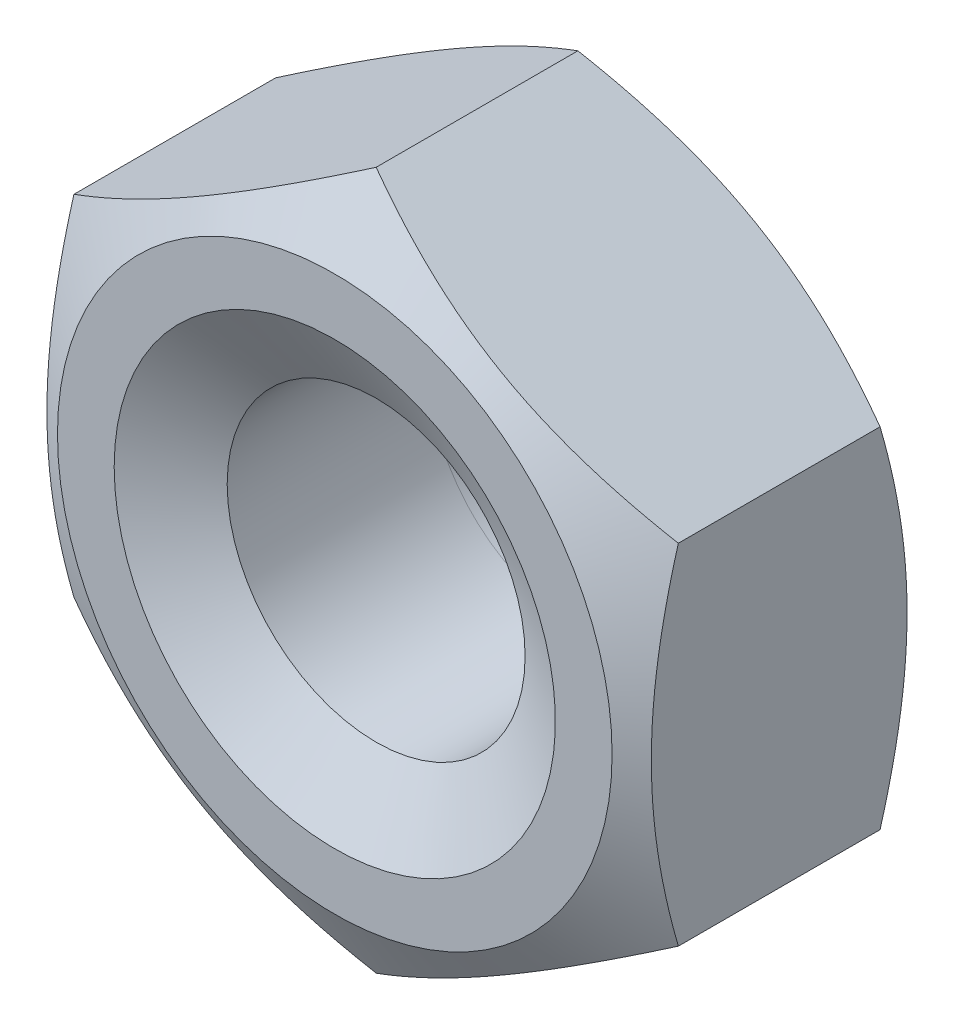
ISO-10303-21;
HEADER;
FILE_DESCRIPTION(('STEP AP214'),'2;1');
FILE_NAME('part.step','',(''),(''),'','','');
FILE_SCHEMA(('AUTOMOTIVE_DESIGN { 1 0 10303 214 1 1 1 1 }'));
ENDSEC;
DATA;
#1=APPLICATION_CONTEXT('core data for automotive mechanical design processes');
#2=APPLICATION_PROTOCOL_DEFINITION('international standard','automotive_design',2000,#1);
#3=PRODUCT_CONTEXT('',#1,'mechanical');
#4=PRODUCT('Part','Part','',(#3));
#5=PRODUCT_RELATED_PRODUCT_CATEGORY('part','',(#4));
#6=PRODUCT_DEFINITION_FORMATION('','',#4);
#7=PRODUCT_DEFINITION_CONTEXT('part definition',#1,'design');
#8=PRODUCT_DEFINITION('design','',#6,#7);
#9=PRODUCT_DEFINITION_SHAPE('','',#8);
#10=(LENGTH_UNIT() NAMED_UNIT(*) SI_UNIT(.MILLI.,.METRE.));
#11=(NAMED_UNIT(*) PLANE_ANGLE_UNIT() SI_UNIT($,.RADIAN.));
#12=(NAMED_UNIT(*) SI_UNIT($,.STERADIAN.) SOLID_ANGLE_UNIT());
#13=UNCERTAINTY_MEASURE_WITH_UNIT(LENGTH_MEASURE(1.E-05),#10,'distance_accuracy_value','');
#14=(GEOMETRIC_REPRESENTATION_CONTEXT(3) GLOBAL_UNCERTAINTY_ASSIGNED_CONTEXT((#13)) GLOBAL_UNIT_ASSIGNED_CONTEXT((#10,
#11,#12)) REPRESENTATION_CONTEXT('',''));
#15=CARTESIAN_POINT('',(0.,0.,0.));
#16=DIRECTION('',(0.,0.,1.));
#17=DIRECTION('',(1.,0.,0.));
#18=AXIS2_PLACEMENT_3D('',#15,#16,#17);
#19=CARTESIAN_POINT('',(0.,0.,0.));
#20=DIRECTION('',(0.,0.,-1.));
#21=DIRECTION('',(-1.,0.,0.));
#22=AXIS2_PLACEMENT_3D('',#19,#20,#21);
#23=CONICAL_SURFACE('',#22,6.20495457622364,1.0471975511966);
#24=CARTESIAN_POINT('',(0.,0.,1.16333456698759));
#25=DIRECTION('',(0.,0.,-1.));
#26=DIRECTION('',(-1.,0.,0.));
#27=AXIS2_PLACEMENT_3D('',#24,#25,#26);
#28=CIRCLE('',#27,4.19);
#29=CARTESIAN_POINT('',(-4.19,0.,1.16333456698759));
#30=VERTEX_POINT('',#29);
#31=EDGE_CURVE('E11',#30,#30,#28,.T.);
#32=ORIENTED_EDGE('',*,*,#31,.T.);
#33=EDGE_LOOP('',(#32));
#34=FACE_BOUND('',#33,.T.);
#35=CARTESIAN_POINT('',(0.,0.,0.));
#36=DIRECTION('',(0.,0.,-1.));
#37=DIRECTION('',(-1.,0.,0.));
#38=AXIS2_PLACEMENT_3D('',#35,#36,#37);
#39=CIRCLE('',#38,6.20495457622364);
#40=CARTESIAN_POINT('',(-6.20495457622364,0.,0.));
#41=VERTEX_POINT('',#40);
#42=EDGE_CURVE('E69',#41,#41,#39,.T.);
#43=ORIENTED_EDGE('',*,*,#42,.F.);
#44=EDGE_LOOP('',(#43));
#45=FACE_BOUND('',#44,.T.);
#46=ADVANCED_FACE('F56',(#34,#45),#23,.T.);
#47=CARTESIAN_POINT('',(0.,0.,0.));
#48=DIRECTION('',(0.,0.,-1.));
#49=DIRECTION('',(-1.,0.,0.));
#50=AXIS2_PLACEMENT_3D('',#47,#48,#49);
#51=CYLINDRICAL_SURFACE('',#50,4.19);
#52=CARTESIAN_POINT('',(0.,0.,0.));
#53=DIRECTION('',(0.,0.,-1.));
#54=DIRECTION('',(-1.,0.,0.));
#55=AXIS2_PLACEMENT_3D('',#52,#53,#54);
#56=CIRCLE('',#55,4.19);
#57=CARTESIAN_POINT('',(-4.19,0.,0.));
#58=VERTEX_POINT('',#57);
#59=EDGE_CURVE('E63',#58,#58,#56,.T.);
#60=ORIENTED_EDGE('',*,*,#59,.T.);
#61=EDGE_LOOP('',(#60));
#62=FACE_BOUND('',#61,.T.);
#63=ORIENTED_EDGE('',*,*,#31,.F.);
#64=EDGE_LOOP('',(#63));
#65=FACE_BOUND('',#64,.T.);
#66=ADVANCED_FACE('F83',(#62,#65),#51,.F.);
#67=CARTESIAN_POINT('',(0.,0.,0.));
#68=DIRECTION('',(0.,0.,1.));
#69=DIRECTION('',(1.,0.,0.));
#70=AXIS2_PLACEMENT_3D('',#67,#68,#69);
#71=PLANE('',#70);
#72=ORIENTED_EDGE('',*,*,#59,.F.);
#73=EDGE_LOOP('',(#72));
#74=FACE_BOUND('',#73,.T.);
#75=ORIENTED_EDGE('',*,*,#42,.T.);
#76=EDGE_LOOP('',(#75));
#77=FACE_BOUND('',#76,.T.);
#78=ADVANCED_FACE('F80',(#74,#77),#71,.F.);
#79=CLOSED_SHELL('',(#46,#66,#78));
#80=MANIFOLD_SOLID_BREP('B2_NOT_SHOWN',#79);
#81=CARTESIAN_POINT('',(-8.5,14.7224318643355,8.));
#82=DIRECTION('',(0.,0.,1.));
#83=DIRECTION('',(1.,0.,0.));
#84=AXIS2_PLACEMENT_3D('',#81,#82,#83);
#85=PLANE('',#84);
#86=CARTESIAN_POINT('',(0.,0.,8.));
#87=DIRECTION('',(0.,0.,-1.));
#88=DIRECTION('',(-1.,0.,0.));
#89=AXIS2_PLACEMENT_3D('',#86,#87,#88);
#90=CIRCLE('',#89,6.20495457622364);
#91=CARTESIAN_POINT('',(-6.20495457622364,0.,8.));
#92=VERTEX_POINT('',#91);
#93=EDGE_CURVE('E377',#92,#92,#90,.T.);
#94=ORIENTED_EDGE('',*,*,#93,.T.);
#95=EDGE_LOOP('',(#94));
#96=FACE_BOUND('',#95,.T.);
#97=CARTESIAN_POINT('',(0.,0.,8.));
#98=DIRECTION('',(0.,0.,-1.));
#99=DIRECTION('',(-1.,0.,0.));
#100=AXIS2_PLACEMENT_3D('',#97,#98,#99);
#101=CIRCLE('',#100,7.8);
#102=CARTESIAN_POINT('',(-7.8,0.,8.));
#103=VERTEX_POINT('',#102);
#104=EDGE_CURVE('E397',#103,#103,#101,.T.);
#105=ORIENTED_EDGE('',*,*,#104,.F.);
#106=EDGE_LOOP('',(#105));
#107=FACE_BOUND('',#106,.T.);
#108=ADVANCED_FACE('F135',(#96,#107),#85,.T.);
#109=CARTESIAN_POINT('',(8.5,4.90747728811182,8.));
#110=DIRECTION('',(-0.5,-0.866025403784439,0.));
#111=DIRECTION('',(0.866025403784439,-0.5,0.));
#112=AXIS2_PLACEMENT_3D('',#109,#110,#111);
#113=PLANE('',#112);
#114=DIRECTION('',(0.,0.,-1.));
#115=VECTOR('',#114,1.);
#116=CARTESIAN_POINT('',(8.5,4.90747728811182,8.));
#117=LINE('',#116,#115);
#118=CARTESIAN_POINT('',(8.5,4.90747728811182,6.83666543301241));
#119=VERTEX_POINT('',#118);
#120=CARTESIAN_POINT('',(8.5,4.90747728811182,1.16333456698759));
#121=VERTEX_POINT('',#120);
#122=EDGE_CURVE('E328',#119,#121,#117,.T.);
#123=ORIENTED_EDGE('',*,*,#122,.T.);
#124=CARTESIAN_POINT('',(8.5002,4.90736181805798,1.16340123483071));
#125=CARTESIAN_POINT('',(8.31336077237731,5.01523349642113,1.10113132768166));
#126=CARTESIAN_POINT('',(8.1258249420654,5.1235073585344,1.04168748418008));
#127=CARTESIAN_POINT('',(7.74923024542823,5.34093440801326,0.929230299192993));
#128=CARTESIAN_POINT('',(7.56017075895663,5.45008795342049,0.876219733415823));
#129=CARTESIAN_POINT('',(6.9899652414386,5.77929626245294,0.727878578163194));
#130=CARTESIAN_POINT('',(6.60656835850853,6.00065055601907,0.643504116370523));
#131=CARTESIAN_POINT('',(6.03282233512584,6.33190297706555,0.544565204127492));
#132=CARTESIAN_POINT('',(5.84418723571481,6.44081150248912,0.516380387880935));
#133=CARTESIAN_POINT('',(5.46606397867089,6.65912106673029,0.469119273198939));
#134=CARTESIAN_POINT('',(5.27657589790345,6.76852206116959,0.450042169985699));
#135=CARTESIAN_POINT('',(4.89727347240179,6.98751241863725,0.421479961098541));
#136=CARTESIAN_POINT('',(4.7074597439177,7.09710142587343,0.41198396990407));
#137=CARTESIAN_POINT('',(4.32765694543931,7.3163806738139,0.402787568071793));
#138=CARTESIAN_POINT('',(4.13766788104353,7.42607091128589,0.403086854800002));
#139=CARTESIAN_POINT('',(3.78247698881905,7.6311404685254,0.412799664006246));
#140=CARTESIAN_POINT('',(3.6172500947862,7.72653426027263,0.421028357030297));
#141=CARTESIAN_POINT('',(3.28718328645605,7.9170984209126,0.444734429489645));
#142=CARTESIAN_POINT('',(3.12234339899756,8.01226877430995,0.460212297551543));
#143=CARTESIAN_POINT('',(2.62846189929869,8.29741139110887,0.517153809291383));
#144=CARTESIAN_POINT('',(2.30029449767179,8.48687892877742,0.56911824971035));
#145=CARTESIAN_POINT('',(1.64047857245564,8.86782383081656,0.699030128955685));
#146=CARTESIAN_POINT('',(1.30891425770532,9.05925257719133,0.777528258304779));
#147=CARTESIAN_POINT('',(0.650730106539539,9.43925537404324,0.955686528405369));
#148=CARTESIAN_POINT('',(0.324101841568922,9.62783429074897,1.05530482456272));
#149=CARTESIAN_POINT('',(-0.000199999999997153,9.81507004627748,1.16340123483071));
#150=B_SPLINE_CURVE_WITH_KNOTS('',3,(#124,#125,#126,#127,#128,#129,#130,#131,#132,#133,#134,
#135,#136,#137,#138,#139,#140,#141,#142,#143,#144,#145,#146,#147,#148,#149),.UNSPECIFIED.,.F.,
.F.,(4,2,2,2,2,2,2,2,2,2,2,2,4),(0.,0.673596396411509,1.34748239783842,2.69805431639326,
3.356799954547,4.01548737369114,4.67342558367776,5.33134346608656,5.9040955679884,
6.47688628148364,7.62328361419565,8.79510569878586,9.9646274374873),.UNSPECIFIED.);
#151=CARTESIAN_POINT('',(0.,9.81495457622364,1.16333456698759));
#152=VERTEX_POINT('',#151);
#153=EDGE_CURVE('E158',#121,#152,#150,.T.);
#154=ORIENTED_EDGE('',*,*,#153,.T.);
#155=DIRECTION('',(0.,0.,-1.));
#156=VECTOR('',#155,1.);
#157=CARTESIAN_POINT('',(0.,9.81495457622364,8.));
#158=LINE('',#157,#156);
#159=CARTESIAN_POINT('',(0.,9.81495457622364,6.83666543301241));
#160=VERTEX_POINT('',#159);
#161=EDGE_CURVE('E212',#160,#152,#158,.T.);
#162=ORIENTED_EDGE('',*,*,#161,.F.);
#163=CARTESIAN_POINT('',(-0.000199999999998283,9.81507004627748,6.83659876516929));
#164=CARTESIAN_POINT('',(0.186639227622692,9.70719836791434,6.89886867231834));
#165=CARTESIAN_POINT('',(0.374175057934598,9.59892450580106,6.95831251581992));
#166=CARTESIAN_POINT('',(0.750769754571765,9.3814974563222,7.07076970080701));
#167=CARTESIAN_POINT('',(0.93982924104337,9.27234391091497,7.12378026658418));
#168=CARTESIAN_POINT('',(1.5100347585614,8.94313560188252,7.2721214218368));
#169=CARTESIAN_POINT('',(1.89343164149147,8.72178130831638,7.35649588362948));
#170=CARTESIAN_POINT('',(2.46717766487416,8.39052888726991,7.45543479587251));
#171=CARTESIAN_POINT('',(2.65581276428519,8.28162036184634,7.48361961211907));
#172=CARTESIAN_POINT('',(3.03393602132911,8.06331079760518,7.53088072680106));
#173=CARTESIAN_POINT('',(3.22342410209655,7.95390980316587,7.5499578300143));
#174=CARTESIAN_POINT('',(3.60272652759821,7.73491944569821,7.57852003890146));
#175=CARTESIAN_POINT('',(3.7925402560823,7.62533043846203,7.58801603009593));
#176=CARTESIAN_POINT('',(4.17234305456069,7.40605119052156,7.59721243192821));
#177=CARTESIAN_POINT('',(4.36233211895647,7.29636095304957,7.5969131452));
#178=CARTESIAN_POINT('',(4.71752301118095,7.09129139581006,7.58720033599375));
#179=CARTESIAN_POINT('',(4.8827499052138,6.99589760406283,7.5789716429697));
#180=CARTESIAN_POINT('',(5.21281671354395,6.80533344342286,7.55526557051035));
#181=CARTESIAN_POINT('',(5.37765660100244,6.71016309002551,7.53978770244846));
#182=CARTESIAN_POINT('',(5.87153810070131,6.42502047322659,7.48284619070862));
#183=CARTESIAN_POINT('',(6.19970550232821,6.23555293555804,7.43088175028965));
#184=CARTESIAN_POINT('',(6.85952142754436,5.8546080335189,7.30096987104432));
#185=CARTESIAN_POINT('',(7.19108574229468,5.66317928714413,7.22247174169522));
#186=CARTESIAN_POINT('',(7.84926989346046,5.28317649029222,7.04431347159463));
#187=CARTESIAN_POINT('',(8.17589815843108,5.09459757358649,6.94469517543729));
#188=CARTESIAN_POINT('',(8.5002,4.90736181805798,6.83659876516929));
#189=B_SPLINE_CURVE_WITH_KNOTS('',3,(#163,#164,#165,#166,#167,#168,#169,#170,#171,#172,#173,
#174,#175,#176,#177,#178,#179,#180,#181,#182,#183,#184,#185,#186,#187,#188),.UNSPECIFIED.,.F.,
.F.,(4,2,2,2,2,2,2,2,2,2,2,2,4),(0.,0.673596396411509,1.34748239783842,2.69805431639326,
3.356799954547,4.01548737369114,4.67342558367776,5.33134346608656,5.9040955679884,
6.47688628148364,7.62328361419565,8.79510569878586,9.9646274374873),.UNSPECIFIED.);
#190=EDGE_CURVE('E316',#160,#119,#189,.T.);
#191=ORIENTED_EDGE('',*,*,#190,.T.);
#192=EDGE_LOOP('',(#123,#154,#162,#191));
#193=FACE_BOUND('',#192,.T.);
#194=ADVANCED_FACE('F137',(#193),#113,.F.);
#195=CARTESIAN_POINT('',(0.,9.81495457622364,8.));
#196=DIRECTION('',(0.5,-0.866025403784439,0.));
#197=DIRECTION('',(0.866025403784439,0.5,0.));
#198=AXIS2_PLACEMENT_3D('',#195,#196,#197);
#199=PLANE('',#198);
#200=ORIENTED_EDGE('',*,*,#161,.T.);
#201=CARTESIAN_POINT('',(0.000200000000001764,9.81507004627748,1.16340123483071));
#202=CARTESIAN_POINT('',(-0.18663922762269,9.70719836791434,1.10113132768166));
#203=CARTESIAN_POINT('',(-0.374175057934596,9.59892450580106,1.04168748418008));
#204=CARTESIAN_POINT('',(-0.750769754571762,9.3814974563222,0.929230299192994));
#205=CARTESIAN_POINT('',(-0.939829241043366,9.27234391091497,0.876219733415823));
#206=CARTESIAN_POINT('',(-1.5100347585614,8.94313560188252,0.727878578163194));
#207=CARTESIAN_POINT('',(-1.89343164149147,8.72178130831639,0.643504116370523));
#208=CARTESIAN_POINT('',(-2.46717766487416,8.39052888726991,0.544565204127491));
#209=CARTESIAN_POINT('',(-2.65581276428518,8.28162036184634,0.516380387880934));
#210=CARTESIAN_POINT('',(-3.03393602132911,8.06331079760518,0.469119273198939));
#211=CARTESIAN_POINT('',(-3.22342410209654,7.95390980316587,0.450042169985699));
#212=CARTESIAN_POINT('',(-3.6027265275982,7.73491944569821,0.421479961098542));
#213=CARTESIAN_POINT('',(-3.79254025608229,7.62533043846204,0.41198396990407));
#214=CARTESIAN_POINT('',(-4.17234305456069,7.40605119052156,0.402787568071792));
#215=CARTESIAN_POINT('',(-4.36233211895647,7.29636095304957,0.403086854800002));
#216=CARTESIAN_POINT('',(-4.71752301118095,7.09129139581007,0.412799664006246));
#217=CARTESIAN_POINT('',(-4.8827499052138,6.99589760406283,0.421028357030298));
#218=CARTESIAN_POINT('',(-5.21281671354395,6.80533344342286,0.444734429489645));
#219=CARTESIAN_POINT('',(-5.37765660100244,6.71016309002551,0.460212297551543));
#220=CARTESIAN_POINT('',(-5.87153810070131,6.42502047322659,0.517153809291382));
#221=CARTESIAN_POINT('',(-6.19970550232821,6.23555293555804,0.56911824971035));
#222=CARTESIAN_POINT('',(-6.85952142754436,5.8546080335189,0.699030128955685));
#223=CARTESIAN_POINT('',(-7.19108574229468,5.66317928714413,0.777528258304779));
#224=CARTESIAN_POINT('',(-7.84926989346046,5.28317649029222,0.95568652840537));
#225=CARTESIAN_POINT('',(-8.17589815843108,5.09459757358649,1.05530482456272));
#226=CARTESIAN_POINT('',(-8.5002,4.90736181805798,1.16340123483071));
#227=B_SPLINE_CURVE_WITH_KNOTS('',3,(#201,#202,#203,#204,#205,#206,#207,#208,#209,#210,#211,
#212,#213,#214,#215,#216,#217,#218,#219,#220,#221,#222,#223,#224,#225,#226),.UNSPECIFIED.,.F.,
.F.,(4,2,2,2,2,2,2,2,2,2,2,2,4),(0.,0.673596396411509,1.34748239783842,2.69805431639326,
3.356799954547,4.01548737369113,4.67342558367776,5.33134346608656,5.9040955679884,
6.47688628148364,7.62328361419565,8.79510569878586,9.9646274374873),.UNSPECIFIED.);
#228=CARTESIAN_POINT('',(-8.5,4.90747728811182,1.16333456698759));
#229=VERTEX_POINT('',#228);
#230=EDGE_CURVE('E196',#152,#229,#227,.T.);
#231=ORIENTED_EDGE('',*,*,#230,.T.);
#232=DIRECTION('',(0.,0.,-1.));
#233=VECTOR('',#232,1.);
#234=CARTESIAN_POINT('',(-8.5,4.90747728811182,8.));
#235=LINE('',#234,#233);
#236=CARTESIAN_POINT('',(-8.5,4.90747728811182,6.83666543301241));
#237=VERTEX_POINT('',#236);
#238=EDGE_CURVE('E210',#237,#229,#235,.T.);
#239=ORIENTED_EDGE('',*,*,#238,.F.);
#240=CARTESIAN_POINT('',(-8.5002,4.90736181805798,6.83659876516929));
#241=CARTESIAN_POINT('',(-8.31336077237731,5.01523349642113,6.89886867231834));
#242=CARTESIAN_POINT('',(-8.1258249420654,5.1235073585344,6.95831251581992));
#243=CARTESIAN_POINT('',(-7.74923024542824,5.34093440801326,7.07076970080701));
#244=CARTESIAN_POINT('',(-7.56017075895663,5.45008795342049,7.12378026658418));
#245=CARTESIAN_POINT('',(-6.9899652414386,5.77929626245294,7.2721214218368));
#246=CARTESIAN_POINT('',(-6.60656835850853,6.00065055601907,7.35649588362948));
#247=CARTESIAN_POINT('',(-6.03282233512584,6.33190297706555,7.45543479587251));
#248=CARTESIAN_POINT('',(-5.84418723571482,6.44081150248912,7.48361961211906));
#249=CARTESIAN_POINT('',(-5.46606397867089,6.65912106673029,7.53088072680106));
#250=CARTESIAN_POINT('',(-5.27657589790346,6.76852206116959,7.5499578300143));
#251=CARTESIAN_POINT('',(-4.8972734724018,6.98751241863725,7.57852003890146));
#252=CARTESIAN_POINT('',(-4.70745974391771,7.09710142587342,7.58801603009593));
#253=CARTESIAN_POINT('',(-4.32765694543931,7.3163806738139,7.59721243192821));
#254=CARTESIAN_POINT('',(-4.13766788104353,7.42607091128589,7.5969131452));
#255=CARTESIAN_POINT('',(-3.78247698881905,7.63114046852539,7.58720033599375));
#256=CARTESIAN_POINT('',(-3.6172500947862,7.72653426027263,7.5789716429697));
#257=CARTESIAN_POINT('',(-3.28718328645605,7.9170984209126,7.55526557051036));
#258=CARTESIAN_POINT('',(-3.12234339899756,8.01226877430995,7.53978770244846));
#259=CARTESIAN_POINT('',(-2.62846189929869,8.29741139110887,7.48284619070862));
#260=CARTESIAN_POINT('',(-2.30029449767179,8.48687892877742,7.43088175028965));
#261=CARTESIAN_POINT('',(-1.64047857245564,8.86782383081656,7.30096987104432));
#262=CARTESIAN_POINT('',(-1.30891425770532,9.05925257719133,7.22247174169522));
#263=CARTESIAN_POINT('',(-0.650730106539535,9.43925537404324,7.04431347159463));
#264=CARTESIAN_POINT('',(-0.324101841568919,9.62783429074897,6.94469517543728));
#265=CARTESIAN_POINT('',(0.000200000000002754,9.81507004627748,6.83659876516929));
#266=B_SPLINE_CURVE_WITH_KNOTS('',3,(#240,#241,#242,#243,#244,#245,#246,#247,#248,#249,#250,
#251,#252,#253,#254,#255,#256,#257,#258,#259,#260,#261,#262,#263,#264,#265),.UNSPECIFIED.,.F.,
.F.,(4,2,2,2,2,2,2,2,2,2,2,2,4),(0.,0.673596396411509,1.34748239783842,2.69805431639326,
3.356799954547,4.01548737369113,4.67342558367776,5.33134346608656,5.9040955679884,
6.47688628148364,7.62328361419565,8.79510569878586,9.9646274374873),.UNSPECIFIED.);
#267=EDGE_CURVE('E308',#237,#160,#266,.T.);
#268=ORIENTED_EDGE('',*,*,#267,.T.);
#269=EDGE_LOOP('',(#200,#231,#239,#268));
#270=FACE_BOUND('',#269,.T.);
#271=ADVANCED_FACE('F208',(#270),#199,.F.);
#272=CARTESIAN_POINT('',(-8.5,4.90747728811182,8.));
#273=DIRECTION('',(1.,0.,0.));
#274=DIRECTION('',(0.,0.,-1.));
#275=AXIS2_PLACEMENT_3D('',#272,#273,#274);
#276=PLANE('',#275);
#277=ORIENTED_EDGE('',*,*,#238,.T.);
#278=CARTESIAN_POINT('',(-8.5,-12.9593811954136,4.4445831317783));
#279=CARTESIAN_POINT('',(-8.5,-12.7730052801023,4.35460816068386));
#280=CARTESIAN_POINT('',(-8.5,-12.5864024892101,4.26510337156205));
#281=CARTESIAN_POINT('',(-8.5,-12.2126952107654,4.08714221370697));
#282=CARTESIAN_POINT('',(-8.5,-12.025590717641,3.99868585667748));
#283=CARTESIAN_POINT('',(-8.5,-11.4633970632728,3.73502546749699));
#284=CARTESIAN_POINT('',(-8.5,-11.0874893107814,3.56155993429166));
#285=CARTESIAN_POINT('',(-8.5,-10.3308772057093,3.21939149987906));
#286=CARTESIAN_POINT('',(-8.5,-9.9501576776206,3.05072206921138));
#287=CARTESIAN_POINT('',(-8.5,-9.1855693370199,2.72070617005383));
#288=CARTESIAN_POINT('',(-8.5,-8.80170069187936,2.55935931531802));
#289=CARTESIAN_POINT('',(-8.5,-8.02569881715881,2.24413413817331));
#290=CARTESIAN_POINT('',(-8.5,-7.63352136661533,2.0903640711098));
#291=CARTESIAN_POINT('',(-8.5,-6.84452195864929,1.79500723622546));
#292=CARTESIAN_POINT('',(-8.5,-6.44769948801445,1.65342182935858));
#293=CARTESIAN_POINT('',(-8.5,-5.64960766642233,1.3862805018689));
#294=CARTESIAN_POINT('',(-8.5,-5.24835001704123,1.2606900070764));
#295=CARTESIAN_POINT('',(-8.5,-4.44014768400429,1.02965111465765));
#296=CARTESIAN_POINT('',(-8.5,-4.03320485775414,0.924196296349474));
#297=CARTESIAN_POINT('',(-8.5,-3.21326379597258,0.738586665979706));
#298=CARTESIAN_POINT('',(-8.5,-2.80026330009668,0.658441562898872));
#299=CARTESIAN_POINT('',(-8.5,-2.17717665803347,0.561251071232788));
#300=CARTESIAN_POINT('',(-8.5,-1.9688578368949,0.53269002284868));
#301=CARTESIAN_POINT('',(-8.5,-1.55126238584582,0.483806396667087));
#302=CARTESIAN_POINT('',(-8.5,-1.34198584829874,0.463483040670459));
#303=CARTESIAN_POINT('',(-8.5,-0.924053900024569,0.431619177068178));
#304=CARTESIAN_POINT('',(-8.5,-0.715402554872798,0.420025554292556));
#305=CARTESIAN_POINT('',(-8.5,-0.297796839610751,0.405681493287387));
#306=CARTESIAN_POINT('',(-8.5,-0.0888424740630232,0.402930923263948));
#307=CARTESIAN_POINT('',(-8.5,0.328936821405097,0.406338273136352));
#308=CARTESIAN_POINT('',(-8.5,0.537761771119559,0.412493742516634));
#309=CARTESIAN_POINT('',(-8.5,0.954972412879199,0.433561739196107));
#310=CARTESIAN_POINT('',(-8.5,1.16335808042936,0.448474742508637));
#311=CARTESIAN_POINT('',(-8.5,1.67007705909359,0.49507694159087));
#312=CARTESIAN_POINT('',(-8.5,1.96800623316433,0.53124598480231));
#313=CARTESIAN_POINT('',(-8.5,2.56149280023897,0.619457609123701));
#314=CARTESIAN_POINT('',(-8.5,2.85704982708992,0.671502594179794));
#315=CARTESIAN_POINT('',(-8.5,3.74069699438318,0.84883680724302));
#316=CARTESIAN_POINT('',(-8.5,4.32460385613245,0.995205199839942));
#317=CARTESIAN_POINT('',(-8.5,5.1979207194104,1.24711186403324));
#318=CARTESIAN_POINT('',(-8.5,5.49190536098573,1.33768665934155));
#319=CARTESIAN_POINT('',(-8.5,6.0770346057582,1.52775049917863));
#320=CARTESIAN_POINT('',(-8.5,6.36817895260368,1.62724034023299));
#321=CARTESIAN_POINT('',(-8.5,6.94617309568548,1.83301127839105));
#322=CARTESIAN_POINT('',(-8.5,7.23303787739934,1.93925070764852));
#323=CARTESIAN_POINT('',(-8.5,7.80433444975845,2.15780678037037));
#324=CARTESIAN_POINT('',(-8.5,8.08876704344191,2.2701213206029));
#325=CARTESIAN_POINT('',(-8.5,8.37217691898802,2.38490295154742));
#326=B_SPLINE_CURVE_WITH_KNOTS('',3,(#278,#279,#280,#281,#282,#283,#284,#285,#286,#287,#288,
#289,#290,#291,#292,#293,#294,#295,#296,#297,#298,#299,#300,#301,#302,#303,#304,#305,#306,#307,
#308,#309,#310,#311,#312,#313,#314,#315,#316,#317,#318,#319,#320,#321,#322,#323,#324,#325),
.UNSPECIFIED.,.F.,.F.,(4,2,2,2,2,2,2,2,2,2,2,2,2,2,2,2,2,2,2,2,2,2,2,4),(0.,0.620871786792665,
1.2417504979445,2.48371317454651,3.73288141488302,4.98198368823383,6.24556546838779,
7.50928820041589,8.77023118755629,10.0307714226948,11.2917946239997,11.9224600677605,
12.5530659198622,13.1798032023583,13.8065311441288,14.4330866731729,15.0596762616224,
15.959513715216,16.8594874905142,18.6629162365996,19.5857095322113,20.5085853582746,
21.4262327978788,22.3435645521087),.UNSPECIFIED.);
#327=CARTESIAN_POINT('',(-8.5,-4.90747728811182,1.16333456698759));
#328=VERTEX_POINT('',#327);
#329=EDGE_CURVE('E193',#229,#328,#326,.F.);
#330=ORIENTED_EDGE('',*,*,#329,.T.);
#331=DIRECTION('',(0.,0.,-1.));
#332=VECTOR('',#331,1.);
#333=CARTESIAN_POINT('',(-8.5,-4.90747728811182,8.));
#334=LINE('',#333,#332);
#335=CARTESIAN_POINT('',(-8.5,-4.90747728811183,6.83666543301241));
#336=VERTEX_POINT('',#335);
#337=EDGE_CURVE('E219',#336,#328,#334,.T.);
#338=ORIENTED_EDGE('',*,*,#337,.F.);
#339=CARTESIAN_POINT('',(-8.5,-12.9593811954136,3.5554168682217));
#340=CARTESIAN_POINT('',(-8.5,-12.7730052801023,3.64539183931614));
#341=CARTESIAN_POINT('',(-8.5,-12.5864024892101,3.73489662843795));
#342=CARTESIAN_POINT('',(-8.5,-12.2126952107654,3.91285778629303));
#343=CARTESIAN_POINT('',(-8.5,-12.025590717641,4.00131414332252));
#344=CARTESIAN_POINT('',(-8.5,-11.4633970632729,4.26497453250301));
#345=CARTESIAN_POINT('',(-8.5,-11.0874893107814,4.43844006570834));
#346=CARTESIAN_POINT('',(-8.5,-10.3308772057093,4.78060850012094));
#347=CARTESIAN_POINT('',(-8.5,-9.9501576776206,4.94927793078862));
#348=CARTESIAN_POINT('',(-8.5,-9.18556933701991,5.27929382994617));
#349=CARTESIAN_POINT('',(-8.5,-8.80170069187936,5.44064068468198));
#350=CARTESIAN_POINT('',(-8.5,-8.02569881715882,5.75586586182668));
#351=CARTESIAN_POINT('',(-8.5,-7.63352136661533,5.9096359288902));
#352=CARTESIAN_POINT('',(-8.5,-6.84452195864929,6.20499276377454));
#353=CARTESIAN_POINT('',(-8.5,-6.44769948801445,6.34657817064142));
#354=CARTESIAN_POINT('',(-8.5,-5.64960766642233,6.6137194981311));
#355=CARTESIAN_POINT('',(-8.5,-5.24835001704123,6.7393099929236));
#356=CARTESIAN_POINT('',(-8.5,-4.44014768400429,6.97034888534235));
#357=CARTESIAN_POINT('',(-8.5,-4.03320485775414,7.07580370365053));
#358=CARTESIAN_POINT('',(-8.5,-3.21326379597258,7.26141333402029));
#359=CARTESIAN_POINT('',(-8.5,-2.80026330009668,7.34155843710113));
#360=CARTESIAN_POINT('',(-8.5,-2.17717665803347,7.43874892876721));
#361=CARTESIAN_POINT('',(-8.5,-1.9688578368949,7.46730997715132));
#362=CARTESIAN_POINT('',(-8.5,-1.55126238584582,7.51619360333291));
#363=CARTESIAN_POINT('',(-8.5,-1.34198584829874,7.53651695932954));
#364=CARTESIAN_POINT('',(-8.5,-0.924053900024566,7.56838082293182));
#365=CARTESIAN_POINT('',(-8.5,-0.715402554872796,7.57997444570744));
#366=CARTESIAN_POINT('',(-8.5,-0.297796839610749,7.59431850671261));
#367=CARTESIAN_POINT('',(-8.5,-0.088842474063022,7.59706907673605));
#368=CARTESIAN_POINT('',(-8.5,0.328936821405098,7.59366172686365));
#369=CARTESIAN_POINT('',(-8.5,0.53776177111956,7.58750625748337));
#370=CARTESIAN_POINT('',(-8.5,0.954972412879199,7.56643826080389));
#371=CARTESIAN_POINT('',(-8.5,1.16335808042936,7.55152525749136));
#372=CARTESIAN_POINT('',(-8.5,1.67007705909359,7.50492305840913));
#373=CARTESIAN_POINT('',(-8.5,1.96800623316433,7.46875401519769));
#374=CARTESIAN_POINT('',(-8.5,2.56149280023897,7.3805423908763));
#375=CARTESIAN_POINT('',(-8.5,2.85704982708992,7.32849740582021));
#376=CARTESIAN_POINT('',(-8.5,3.74069699438318,7.15116319275698));
#377=CARTESIAN_POINT('',(-8.5,4.32460385613245,7.00479480016006));
#378=CARTESIAN_POINT('',(-8.5,5.1979207194104,6.75288813596676));
#379=CARTESIAN_POINT('',(-8.5,5.49190536098573,6.66231334065845));
#380=CARTESIAN_POINT('',(-8.5,6.0770346057582,6.47224950082137));
#381=CARTESIAN_POINT('',(-8.5,6.36817895260368,6.37275965976701));
#382=CARTESIAN_POINT('',(-8.5,6.94617309568548,6.16698872160895));
#383=CARTESIAN_POINT('',(-8.5,7.23303787739934,6.06074929235148));
#384=CARTESIAN_POINT('',(-8.5,7.80433444975845,5.84219321962963));
#385=CARTESIAN_POINT('',(-8.5,8.08876704344191,5.7298786793971));
#386=CARTESIAN_POINT('',(-8.5,8.37217691898802,5.61509704845258));
#387=B_SPLINE_CURVE_WITH_KNOTS('',3,(#339,#340,#341,#342,#343,#344,#345,#346,#347,#348,#349,
#350,#351,#352,#353,#354,#355,#356,#357,#358,#359,#360,#361,#362,#363,#364,#365,#366,#367,#368,
#369,#370,#371,#372,#373,#374,#375,#376,#377,#378,#379,#380,#381,#382,#383,#384,#385,#386),
.UNSPECIFIED.,.F.,.F.,(4,2,2,2,2,2,2,2,2,2,2,2,2,2,2,2,2,2,2,2,2,2,2,4),(0.,0.620871786792663,
1.24175049794449,2.48371317454651,3.73288141488301,4.98198368823383,6.24556546838779,
7.50928820041589,8.77023118755629,10.0307714226948,11.2917946239997,11.9224600677605,
12.5530659198622,13.1798032023583,13.8065311441288,14.4330866731729,15.0596762616224,
15.959513715216,16.8594874905142,18.6629162365996,19.5857095322113,20.5085853582746,
21.4262327978788,22.3435645521087),.UNSPECIFIED.);
#388=EDGE_CURVE('E217',#336,#237,#387,.T.);
#389=ORIENTED_EDGE('',*,*,#388,.T.);
#390=EDGE_LOOP('',(#277,#330,#338,#389));
#391=FACE_BOUND('',#390,.T.);
#392=ADVANCED_FACE('F216',(#391),#276,.F.);
#393=CARTESIAN_POINT('',(-8.5,-4.90747728811182,8.));
#394=DIRECTION('',(0.5,0.866025403784439,0.));
#395=DIRECTION('',(-0.866025403784438,0.5,0.));
#396=AXIS2_PLACEMENT_3D('',#393,#394,#395);
#397=PLANE('',#396);
#398=ORIENTED_EDGE('',*,*,#337,.T.);
#399=CARTESIAN_POINT('',(-8.5002,-4.90736181805798,1.16340123483071));
#400=CARTESIAN_POINT('',(-8.31336077237731,-5.01523349642112,1.10113132768166));
#401=CARTESIAN_POINT('',(-8.1258249420654,-5.1235073585344,1.04168748418008));
#402=CARTESIAN_POINT('',(-7.74923024542824,-5.34093440801326,0.929230299192994));
#403=CARTESIAN_POINT('',(-7.56017075895663,-5.45008795342049,0.876219733415824));
#404=CARTESIAN_POINT('',(-6.9899652414386,-5.77929626245294,0.727878578163195));
#405=CARTESIAN_POINT('',(-6.60656835850853,-6.00065055601907,0.643504116370523));
#406=CARTESIAN_POINT('',(-6.03282233512584,-6.33190297706555,0.544565204127492));
#407=CARTESIAN_POINT('',(-5.84418723571482,-6.44081150248912,0.516380387880935));
#408=CARTESIAN_POINT('',(-5.46606397867089,-6.65912106673029,0.469119273198939));
#409=CARTESIAN_POINT('',(-5.27657589790346,-6.76852206116959,0.450042169985699));
#410=CARTESIAN_POINT('',(-4.8972734724018,-6.98751241863725,0.421479961098541));
#411=CARTESIAN_POINT('',(-4.70745974391771,-7.09710142587343,0.41198396990407));
#412=CARTESIAN_POINT('',(-4.32765694543931,-7.3163806738139,0.402787568071793));
#413=CARTESIAN_POINT('',(-4.13766788104353,-7.42607091128589,0.403086854800002));
#414=CARTESIAN_POINT('',(-3.78247698881905,-7.63114046852539,0.412799664006247));
#415=CARTESIAN_POINT('',(-3.6172500947862,-7.72653426027263,0.421028357030299));
#416=CARTESIAN_POINT('',(-3.28718328645605,-7.9170984209126,0.444734429489646));
#417=CARTESIAN_POINT('',(-3.12234339899756,-8.01226877430995,0.460212297551543));
#418=CARTESIAN_POINT('',(-2.62846189929869,-8.29741139110887,0.517153809291382));
#419=CARTESIAN_POINT('',(-2.30029449767179,-8.48687892877742,0.56911824971035));
#420=CARTESIAN_POINT('',(-1.64047857245564,-8.86782383081656,0.699030128955685));
#421=CARTESIAN_POINT('',(-1.30891425770532,-9.05925257719133,0.77752825830478));
#422=CARTESIAN_POINT('',(-0.65073010653954,-9.43925537404324,0.955686528405369));
#423=CARTESIAN_POINT('',(-0.324101841568925,-9.62783429074897,1.05530482456272));
#424=CARTESIAN_POINT('',(0.000199999999995881,-9.81507004627748,1.16340123483071));
#425=B_SPLINE_CURVE_WITH_KNOTS('',3,(#399,#400,#401,#402,#403,#404,#405,#406,#407,#408,#409,
#410,#411,#412,#413,#414,#415,#416,#417,#418,#419,#420,#421,#422,#423,#424),.UNSPECIFIED.,.F.,
.F.,(4,2,2,2,2,2,2,2,2,2,2,2,4),(0.,0.673596396411509,1.34748239783842,2.69805431639326,
3.356799954547,4.01548737369114,4.67342558367776,5.33134346608656,5.9040955679884,
6.47688628148364,7.62328361419565,8.79510569878586,9.9646274374873),.UNSPECIFIED.);
#426=CARTESIAN_POINT('',(0.,-9.81495457622364,1.16333456698759));
#427=VERTEX_POINT('',#426);
#428=EDGE_CURVE('E198',#328,#427,#425,.T.);
#429=ORIENTED_EDGE('',*,*,#428,.T.);
#430=DIRECTION('',(0.,0.,-1.));
#431=VECTOR('',#430,1.);
#432=CARTESIAN_POINT('',(0.,-9.81495457622364,8.));
#433=LINE('',#432,#431);
#434=CARTESIAN_POINT('',(0.,-9.81495457622364,6.83666543301241));
#435=VERTEX_POINT('',#434);
#436=EDGE_CURVE('E226',#435,#427,#433,.T.);
#437=ORIENTED_EDGE('',*,*,#436,.F.);
#438=CARTESIAN_POINT('',(0.000199999999997001,-9.81507004627748,6.83659876516929));
#439=CARTESIAN_POINT('',(-0.186639227622694,-9.70719836791434,6.89886867231834));
#440=CARTESIAN_POINT('',(-0.3741750579346,-9.59892450580106,6.95831251581992));
#441=CARTESIAN_POINT('',(-0.750769754571766,-9.3814974563222,7.07076970080701));
#442=CARTESIAN_POINT('',(-0.939829241043371,-9.27234391091497,7.12378026658418));
#443=CARTESIAN_POINT('',(-1.5100347585614,-8.94313560188252,7.2721214218368));
#444=CARTESIAN_POINT('',(-1.89343164149147,-8.72178130831639,7.35649588362948));
#445=CARTESIAN_POINT('',(-2.46717766487416,-8.39052888726991,7.45543479587251));
#446=CARTESIAN_POINT('',(-2.65581276428519,-8.28162036184634,7.48361961211906));
#447=CARTESIAN_POINT('',(-3.03393602132911,-8.06331079760518,7.53088072680106));
#448=CARTESIAN_POINT('',(-3.22342410209655,-7.95390980316587,7.5499578300143));
#449=CARTESIAN_POINT('',(-3.60272652759821,-7.73491944569821,7.57852003890146));
#450=CARTESIAN_POINT('',(-3.7925402560823,-7.62533043846203,7.58801603009593));
#451=CARTESIAN_POINT('',(-4.17234305456069,-7.40605119052156,7.59721243192821));
#452=CARTESIAN_POINT('',(-4.36233211895647,-7.29636095304957,7.5969131452));
#453=CARTESIAN_POINT('',(-4.71752301118095,-7.09129139581006,7.58720033599375));
#454=CARTESIAN_POINT('',(-4.8827499052138,-6.99589760406283,7.5789716429697));
#455=CARTESIAN_POINT('',(-5.21281671354396,-6.80533344342286,7.55526557051035));
#456=CARTESIAN_POINT('',(-5.37765660100245,-6.71016309002551,7.53978770244846));
#457=CARTESIAN_POINT('',(-5.87153810070131,-6.42502047322659,7.48284619070862));
#458=CARTESIAN_POINT('',(-6.19970550232821,-6.23555293555804,7.43088175028965));
#459=CARTESIAN_POINT('',(-6.85952142754436,-5.8546080335189,7.30096987104432));
#460=CARTESIAN_POINT('',(-7.19108574229468,-5.66317928714413,7.22247174169522));
#461=CARTESIAN_POINT('',(-7.84926989346046,-5.28317649029222,7.04431347159463));
#462=CARTESIAN_POINT('',(-8.17589815843108,-5.09459757358649,6.94469517543728));
#463=CARTESIAN_POINT('',(-8.5002,-4.90736181805798,6.83659876516929));
#464=B_SPLINE_CURVE_WITH_KNOTS('',3,(#438,#439,#440,#441,#442,#443,#444,#445,#446,#447,#448,
#449,#450,#451,#452,#453,#454,#455,#456,#457,#458,#459,#460,#461,#462,#463),.UNSPECIFIED.,.F.,
.F.,(4,2,2,2,2,2,2,2,2,2,2,2,4),(0.,0.67359639641151,1.34748239783842,2.69805431639326,
3.356799954547,4.01548737369114,4.67342558367776,5.33134346608656,5.9040955679884,
6.47688628148364,7.62328361419565,8.79510569878586,9.9646274374873),.UNSPECIFIED.);
#465=EDGE_CURVE('E343',#435,#336,#464,.T.);
#466=ORIENTED_EDGE('',*,*,#465,.T.);
#467=EDGE_LOOP('',(#398,#429,#437,#466));
#468=FACE_BOUND('',#467,.T.);
#469=ADVANCED_FACE('F251',(#468),#397,.F.);
#470=CARTESIAN_POINT('',(0.,-9.81495457622364,8.));
#471=DIRECTION('',(-0.5,0.866025403784439,0.));
#472=DIRECTION('',(-0.866025403784439,-0.5,0.));
#473=AXIS2_PLACEMENT_3D('',#470,#471,#472);
#474=PLANE('',#473);
#475=ORIENTED_EDGE('',*,*,#436,.T.);
#476=CARTESIAN_POINT('',(-0.000200000000003047,-9.81507004627748,1.16340123483071));
#477=CARTESIAN_POINT('',(0.186639227622688,-9.70719836791434,1.10113132768166));
#478=CARTESIAN_POINT('',(0.374175057934594,-9.59892450580106,1.04168748418008));
#479=CARTESIAN_POINT('',(0.75076975457176,-9.3814974563222,0.929230299192993));
#480=CARTESIAN_POINT('',(0.939829241043365,-9.27234391091497,0.876219733415823));
#481=CARTESIAN_POINT('',(1.5100347585614,-8.94313560188252,0.727878578163194));
#482=CARTESIAN_POINT('',(1.89343164149146,-8.72178130831639,0.643504116370522));
#483=CARTESIAN_POINT('',(2.46717766487416,-8.39052888726991,0.544565204127491));
#484=CARTESIAN_POINT('',(2.65581276428518,-8.28162036184635,0.516380387880935));
#485=CARTESIAN_POINT('',(3.03393602132911,-8.06331079760518,0.469119273198939));
#486=CARTESIAN_POINT('',(3.22342410209654,-7.95390980316587,0.450042169985699));
#487=CARTESIAN_POINT('',(3.6027265275982,-7.73491944569821,0.421479961098541));
#488=CARTESIAN_POINT('',(3.79254025608229,-7.62533043846204,0.41198396990407));
#489=CARTESIAN_POINT('',(4.17234305456069,-7.40605119052156,0.402787568071792));
#490=CARTESIAN_POINT('',(4.36233211895647,-7.29636095304957,0.403086854800001));
#491=CARTESIAN_POINT('',(4.71752301118095,-7.09129139581007,0.412799664006246));
#492=CARTESIAN_POINT('',(4.8827499052138,-6.99589760406283,0.421028357030299));
#493=CARTESIAN_POINT('',(5.21281671354395,-6.80533344342286,0.444734429489646));
#494=CARTESIAN_POINT('',(5.37765660100244,-6.71016309002551,0.460212297551542));
#495=CARTESIAN_POINT('',(5.87153810070131,-6.42502047322659,0.517153809291381));
#496=CARTESIAN_POINT('',(6.19970550232821,-6.23555293555804,0.56911824971035));
#497=CARTESIAN_POINT('',(6.85952142754436,-5.8546080335189,0.699030128955686));
#498=CARTESIAN_POINT('',(7.19108574229468,-5.66317928714413,0.777528258304779));
#499=CARTESIAN_POINT('',(7.84926989346046,-5.28317649029222,0.955686528405369));
#500=CARTESIAN_POINT('',(8.17589815843108,-5.09459757358649,1.05530482456272));
#501=CARTESIAN_POINT('',(8.5002,-4.90736181805798,1.16340123483071));
#502=B_SPLINE_CURVE_WITH_KNOTS('',3,(#476,#477,#478,#479,#480,#481,#482,#483,#484,#485,#486,
#487,#488,#489,#490,#491,#492,#493,#494,#495,#496,#497,#498,#499,#500,#501),.UNSPECIFIED.,.F.,
.F.,(4,2,2,2,2,2,2,2,2,2,2,2,4),(0.,0.673596396411509,1.34748239783842,2.69805431639326,
3.356799954547,4.01548737369113,4.67342558367776,5.33134346608656,5.9040955679884,
6.47688628148364,7.62328361419565,8.79510569878586,9.9646274374873),.UNSPECIFIED.);
#503=CARTESIAN_POINT('',(8.5,-4.90747728811182,1.16333456698759));
#504=VERTEX_POINT('',#503);
#505=EDGE_CURVE('E264',#427,#504,#502,.T.);
#506=ORIENTED_EDGE('',*,*,#505,.T.);
#507=DIRECTION('',(0.,0.,-1.));
#508=VECTOR('',#507,1.);
#509=CARTESIAN_POINT('',(8.5,-4.90747728811182,8.));
#510=LINE('',#509,#508);
#511=CARTESIAN_POINT('',(8.5,-4.90747728811182,6.83666543301241));
#512=VERTEX_POINT('',#511);
#513=EDGE_CURVE('E332',#512,#504,#510,.T.);
#514=ORIENTED_EDGE('',*,*,#513,.F.);
#515=CARTESIAN_POINT('',(8.5002,-4.90736181805798,6.83659876516929));
#516=CARTESIAN_POINT('',(8.31336077237731,-5.01523349642113,6.89886867231834));
#517=CARTESIAN_POINT('',(8.1258249420654,-5.12350735853441,6.95831251581992));
#518=CARTESIAN_POINT('',(7.74923024542824,-5.34093440801326,7.07076970080701));
#519=CARTESIAN_POINT('',(7.56017075895663,-5.45008795342049,7.12378026658418));
#520=CARTESIAN_POINT('',(6.9899652414386,-5.77929626245294,7.27212142183681));
#521=CARTESIAN_POINT('',(6.60656835850853,-6.00065055601908,7.35649588362948));
#522=CARTESIAN_POINT('',(6.03282233512584,-6.33190297706555,7.45543479587251));
#523=CARTESIAN_POINT('',(5.84418723571481,-6.44081150248912,7.48361961211906));
#524=CARTESIAN_POINT('',(5.46606397867089,-6.65912106673029,7.53088072680106));
#525=CARTESIAN_POINT('',(5.27657589790346,-6.76852206116959,7.5499578300143));
#526=CARTESIAN_POINT('',(4.8972734724018,-6.98751241863725,7.57852003890146));
#527=CARTESIAN_POINT('',(4.70745974391771,-7.09710142587343,7.58801603009593));
#528=CARTESIAN_POINT('',(4.32765694543931,-7.3163806738139,7.59721243192821));
#529=CARTESIAN_POINT('',(4.13766788104353,-7.42607091128589,7.5969131452));
#530=CARTESIAN_POINT('',(3.78247698881905,-7.6311404685254,7.58720033599375));
#531=CARTESIAN_POINT('',(3.6172500947862,-7.72653426027263,7.5789716429697));
#532=CARTESIAN_POINT('',(3.28718328645604,-7.9170984209126,7.55526557051036));
#533=CARTESIAN_POINT('',(3.12234339899755,-8.01226877430995,7.53978770244846));
#534=CARTESIAN_POINT('',(2.62846189929869,-8.29741139110887,7.48284619070862));
#535=CARTESIAN_POINT('',(2.30029449767179,-8.48687892877742,7.43088175028965));
#536=CARTESIAN_POINT('',(1.64047857245564,-8.86782383081656,7.30096987104432));
#537=CARTESIAN_POINT('',(1.30891425770532,-9.05925257719133,7.22247174169522));
#538=CARTESIAN_POINT('',(0.650730106539534,-9.43925537404324,7.04431347159463));
#539=CARTESIAN_POINT('',(0.324101841568917,-9.62783429074897,6.94469517543728));
#540=CARTESIAN_POINT('',(-0.000200000000003787,-9.81507004627748,6.83659876516929));
#541=B_SPLINE_CURVE_WITH_KNOTS('',3,(#515,#516,#517,#518,#519,#520,#521,#522,#523,#524,#525,
#526,#527,#528,#529,#530,#531,#532,#533,#534,#535,#536,#537,#538,#539,#540),.UNSPECIFIED.,.F.,
.F.,(4,2,2,2,2,2,2,2,2,2,2,2,4),(0.,0.673596396411509,1.34748239783842,2.69805431639326,
3.356799954547,4.01548737369113,4.67342558367776,5.33134346608656,5.9040955679884,
6.47688628148364,7.62328361419565,8.79510569878586,9.96462743748731),.UNSPECIFIED.);
#542=EDGE_CURVE('E165',#512,#435,#541,.T.);
#543=ORIENTED_EDGE('',*,*,#542,.T.);
#544=EDGE_LOOP('',(#475,#506,#514,#543));
#545=FACE_BOUND('',#544,.T.);
#546=ADVANCED_FACE('F243',(#545),#474,.F.);
#547=CARTESIAN_POINT('',(8.5,-4.90747728811182,8.));
#548=DIRECTION('',(-1.,0.,0.));
#549=DIRECTION('',(0.,0.,1.));
#550=AXIS2_PLACEMENT_3D('',#547,#548,#549);
#551=PLANE('',#550);
#552=ORIENTED_EDGE('',*,*,#513,.T.);
#553=CARTESIAN_POINT('',(8.5,-12.9593811954136,4.4445831317783));
#554=CARTESIAN_POINT('',(8.5,-12.7730052801023,4.35460816068386));
#555=CARTESIAN_POINT('',(8.5,-12.5864024892101,4.26510337156205));
#556=CARTESIAN_POINT('',(8.5,-12.2126952107654,4.08714221370697));
#557=CARTESIAN_POINT('',(8.5,-12.025590717641,3.99868585667748));
#558=CARTESIAN_POINT('',(8.5,-11.4633970632728,3.73502546749699));
#559=CARTESIAN_POINT('',(8.5,-11.0874893107814,3.56155993429166));
#560=CARTESIAN_POINT('',(8.5,-10.3308772057093,3.21939149987906));
#561=CARTESIAN_POINT('',(8.5,-9.9501576776206,3.05072206921138));
#562=CARTESIAN_POINT('',(8.5,-9.1855693370199,2.72070617005383));
#563=CARTESIAN_POINT('',(8.5,-8.80170069187936,2.55935931531802));
#564=CARTESIAN_POINT('',(8.5,-8.02569881715882,2.24413413817331));
#565=CARTESIAN_POINT('',(8.5,-7.63352136661533,2.0903640711098));
#566=CARTESIAN_POINT('',(8.5,-6.84452195864929,1.79500723622546));
#567=CARTESIAN_POINT('',(8.5,-6.44769948801445,1.65342182935858));
#568=CARTESIAN_POINT('',(8.5,-5.64960766642233,1.3862805018689));
#569=CARTESIAN_POINT('',(8.5,-5.24835001704124,1.2606900070764));
#570=CARTESIAN_POINT('',(8.5,-4.44014768400429,1.02965111465765));
#571=CARTESIAN_POINT('',(8.5,-4.03320485775414,0.924196296349474));
#572=CARTESIAN_POINT('',(8.5,-3.21326379597258,0.738586665979706));
#573=CARTESIAN_POINT('',(8.5,-2.80026330009668,0.658441562898871));
#574=CARTESIAN_POINT('',(8.5,-2.17717665803347,0.561251071232787));
#575=CARTESIAN_POINT('',(8.5,-1.9688578368949,0.532690022848679));
#576=CARTESIAN_POINT('',(8.5,-1.55126238584582,0.483806396667086));
#577=CARTESIAN_POINT('',(8.5,-1.34198584829875,0.463483040670458));
#578=CARTESIAN_POINT('',(8.5,-0.924053900024569,0.431619177068177));
#579=CARTESIAN_POINT('',(8.5,-0.715402554872798,0.420025554292555));
#580=CARTESIAN_POINT('',(8.5,-0.297796839610751,0.405681493287386));
#581=CARTESIAN_POINT('',(8.5,-0.0888424740630236,0.402930923263948));
#582=CARTESIAN_POINT('',(8.5,0.328936821405097,0.406338273136352));
#583=CARTESIAN_POINT('',(8.5,0.537761771119559,0.412493742516634));
#584=CARTESIAN_POINT('',(8.5,0.954972412879198,0.433561739196106));
#585=CARTESIAN_POINT('',(8.5,1.16335808042936,0.448474742508636));
#586=CARTESIAN_POINT('',(8.5,1.67007705909359,0.495076941590869));
#587=CARTESIAN_POINT('',(8.5,1.96800623316433,0.531245984802308));
#588=CARTESIAN_POINT('',(8.5,2.56149280023897,0.6194576091237));
#589=CARTESIAN_POINT('',(8.5,2.85704982708992,0.671502594179793));
#590=CARTESIAN_POINT('',(8.5,3.74069699438318,0.848836807243019));
#591=CARTESIAN_POINT('',(8.5,4.32460385613245,0.99520519983994));
#592=CARTESIAN_POINT('',(8.5,5.19792071941039,1.24711186403324));
#593=CARTESIAN_POINT('',(8.5,5.49190536098573,1.33768665934155));
#594=CARTESIAN_POINT('',(8.5,6.0770346057582,1.52775049917863));
#595=CARTESIAN_POINT('',(8.5,6.36817895260367,1.62724034023299));
#596=CARTESIAN_POINT('',(8.5,6.94617309568548,1.83301127839105));
#597=CARTESIAN_POINT('',(8.5,7.23303787739933,1.93925070764851));
#598=CARTESIAN_POINT('',(8.5,7.80433444975845,2.15780678037037));
#599=CARTESIAN_POINT('',(8.5,8.08876704344191,2.2701213206029));
#600=CARTESIAN_POINT('',(8.5,8.37217691898801,2.38490295154741));
#601=B_SPLINE_CURVE_WITH_KNOTS('',3,(#553,#554,#555,#556,#557,#558,#559,#560,#561,#562,#563,
#564,#565,#566,#567,#568,#569,#570,#571,#572,#573,#574,#575,#576,#577,#578,#579,#580,#581,#582,
#583,#584,#585,#586,#587,#588,#589,#590,#591,#592,#593,#594,#595,#596,#597,#598,#599,#600),
.UNSPECIFIED.,.F.,.F.,(4,2,2,2,2,2,2,2,2,2,2,2,2,2,2,2,2,2,2,2,2,2,2,4),(0.,0.620871786792667,
1.2417504979445,2.48371317454652,3.73288141488302,4.98198368823383,6.24556546838779,
7.50928820041589,8.77023118755629,10.0307714226948,11.2917946239997,11.9224600677605,
12.5530659198622,13.1798032023583,13.8065311441288,14.4330866731729,15.0596762616224,
15.959513715216,16.8594874905142,18.6629162365996,19.5857095322113,20.5085853582746,
21.4262327978788,22.3435645521087),.UNSPECIFIED.);
#602=EDGE_CURVE('E54',#504,#121,#601,.T.);
#603=ORIENTED_EDGE('',*,*,#602,.T.);
#604=ORIENTED_EDGE('',*,*,#122,.F.);
#605=CARTESIAN_POINT('',(8.5,-12.9593811954136,3.5554168682217));
#606=CARTESIAN_POINT('',(8.5,-12.7730052801023,3.64539183931614));
#607=CARTESIAN_POINT('',(8.5,-12.5864024892101,3.73489662843795));
#608=CARTESIAN_POINT('',(8.5,-12.2126952107654,3.91285778629303));
#609=CARTESIAN_POINT('',(8.5,-12.025590717641,4.00131414332252));
#610=CARTESIAN_POINT('',(8.5,-11.4633970632729,4.26497453250301));
#611=CARTESIAN_POINT('',(8.5,-11.0874893107814,4.43844006570834));
#612=CARTESIAN_POINT('',(8.5,-10.3308772057093,4.78060850012094));
#613=CARTESIAN_POINT('',(8.5,-9.9501576776206,4.94927793078862));
#614=CARTESIAN_POINT('',(8.5,-9.18556933701991,5.27929382994617));
#615=CARTESIAN_POINT('',(8.5,-8.80170069187936,5.44064068468198));
#616=CARTESIAN_POINT('',(8.5,-8.02569881715882,5.75586586182668));
#617=CARTESIAN_POINT('',(8.5,-7.63352136661533,5.9096359288902));
#618=CARTESIAN_POINT('',(8.5,-6.84452195864929,6.20499276377454));
#619=CARTESIAN_POINT('',(8.5,-6.44769948801445,6.34657817064142));
#620=CARTESIAN_POINT('',(8.5,-5.64960766642233,6.6137194981311));
#621=CARTESIAN_POINT('',(8.5,-5.24835001704123,6.7393099929236));
#622=CARTESIAN_POINT('',(8.5,-4.44014768400429,6.97034888534235));
#623=CARTESIAN_POINT('',(8.5,-4.03320485775414,7.07580370365053));
#624=CARTESIAN_POINT('',(8.5,-3.21326379597258,7.2614133340203));
#625=CARTESIAN_POINT('',(8.5,-2.80026330009668,7.34155843710113));
#626=CARTESIAN_POINT('',(8.5,-2.17717665803347,7.43874892876721));
#627=CARTESIAN_POINT('',(8.5,-1.9688578368949,7.46730997715132));
#628=CARTESIAN_POINT('',(8.5,-1.55126238584582,7.51619360333291));
#629=CARTESIAN_POINT('',(8.5,-1.34198584829874,7.53651695932954));
#630=CARTESIAN_POINT('',(8.5,-0.924053900024567,7.56838082293182));
#631=CARTESIAN_POINT('',(8.5,-0.715402554872796,7.57997444570745));
#632=CARTESIAN_POINT('',(8.5,-0.297796839610749,7.59431850671261));
#633=CARTESIAN_POINT('',(8.5,-0.0888424740630224,7.59706907673605));
#634=CARTESIAN_POINT('',(8.5,0.328936821405097,7.59366172686365));
#635=CARTESIAN_POINT('',(8.5,0.537761771119558,7.58750625748337));
#636=CARTESIAN_POINT('',(8.5,0.954972412879197,7.56643826080389));
#637=CARTESIAN_POINT('',(8.5,1.16335808042936,7.55152525749136));
#638=CARTESIAN_POINT('',(8.5,1.67007705909359,7.50492305840913));
#639=CARTESIAN_POINT('',(8.5,1.96800623316433,7.46875401519769));
#640=CARTESIAN_POINT('',(8.5,2.56149280023896,7.3805423908763));
#641=CARTESIAN_POINT('',(8.5,2.85704982708992,7.32849740582021));
#642=CARTESIAN_POINT('',(8.5,3.74069699438317,7.15116319275698));
#643=CARTESIAN_POINT('',(8.5,4.32460385613244,7.00479480016006));
#644=CARTESIAN_POINT('',(8.5,5.19792071941039,6.75288813596676));
#645=CARTESIAN_POINT('',(8.5,5.49190536098572,6.66231334065846));
#646=CARTESIAN_POINT('',(8.5,6.07703460575819,6.47224950082137));
#647=CARTESIAN_POINT('',(8.5,6.36817895260367,6.37275965976702));
#648=CARTESIAN_POINT('',(8.5,6.94617309568548,6.16698872160895));
#649=CARTESIAN_POINT('',(8.5,7.23303787739933,6.06074929235149));
#650=CARTESIAN_POINT('',(8.5,7.80433444975845,5.84219321962963));
#651=CARTESIAN_POINT('',(8.5,8.08876704344191,5.7298786793971));
#652=CARTESIAN_POINT('',(8.5,8.37217691898801,5.61509704845259));
#653=B_SPLINE_CURVE_WITH_KNOTS('',3,(#605,#606,#607,#608,#609,#610,#611,#612,#613,#614,#615,
#616,#617,#618,#619,#620,#621,#622,#623,#624,#625,#626,#627,#628,#629,#630,#631,#632,#633,#634,
#635,#636,#637,#638,#639,#640,#641,#642,#643,#644,#645,#646,#647,#648,#649,#650,#651,#652),
.UNSPECIFIED.,.F.,.F.,(4,2,2,2,2,2,2,2,2,2,2,2,2,2,2,2,2,2,2,2,2,2,2,4),(0.,0.620871786792665,
1.24175049794449,2.48371317454651,3.73288141488301,4.98198368823383,6.24556546838779,
7.50928820041589,8.77023118755629,10.0307714226948,11.2917946239997,11.9224600677605,
12.5530659198622,13.1798032023583,13.8065311441288,14.4330866731729,15.0596762616224,
15.959513715216,16.8594874905142,18.6629162365996,19.5857095322113,20.5085853582746,
21.4262327978788,22.3435645521087),.UNSPECIFIED.);
#654=EDGE_CURVE('E151',#119,#512,#653,.F.);
#655=ORIENTED_EDGE('',*,*,#654,.T.);
#656=EDGE_LOOP('',(#552,#603,#604,#655));
#657=FACE_BOUND('',#656,.T.);
#658=ADVANCED_FACE('F238',(#657),#551,.F.);
#659=CARTESIAN_POINT('',(0.,0.,8.));
#660=DIRECTION('',(0.,0.,-1.));
#661=DIRECTION('',(-1.,0.,0.));
#662=AXIS2_PLACEMENT_3D('',#659,#660,#661);
#663=CONICAL_SURFACE('',#662,7.8,1.0471975511966);
#664=ORIENTED_EDGE('',*,*,#104,.T.);
#665=EDGE_LOOP('',(#664));
#666=FACE_BOUND('',#665,.T.);
#667=ORIENTED_EDGE('',*,*,#267,.F.);
#668=ORIENTED_EDGE('',*,*,#388,.F.);
#669=ORIENTED_EDGE('',*,*,#465,.F.);
#670=ORIENTED_EDGE('',*,*,#542,.F.);
#671=ORIENTED_EDGE('',*,*,#654,.F.);
#672=ORIENTED_EDGE('',*,*,#190,.F.);
#673=EDGE_LOOP('',(#667,#668,#669,#670,#671,#672));
#674=FACE_BOUND('',#673,.T.);
#675=ADVANCED_FACE('F235',(#666,#674),#663,.T.);
#676=CARTESIAN_POINT('',(0.,0.,6.83666543301241));
#677=DIRECTION('',(0.,0.,1.));
#678=DIRECTION('',(1.,0.,0.));
#679=AXIS2_PLACEMENT_3D('',#676,#677,#678);
#680=CONICAL_SURFACE('',#679,4.19,1.0471975511966);
#681=ORIENTED_EDGE('',*,*,#93,.F.);
#682=EDGE_LOOP('',(#681));
#683=FACE_BOUND('',#682,.T.);
#684=CARTESIAN_POINT('',(0.,0.,6.83666543301241));
#685=DIRECTION('',(0.,0.,-1.));
#686=DIRECTION('',(-1.,0.,0.));
#687=AXIS2_PLACEMENT_3D('',#684,#685,#686);
#688=CIRCLE('',#687,4.19);
#689=CARTESIAN_POINT('',(-4.19,0.,6.83666543301241));
#690=VERTEX_POINT('',#689);
#691=EDGE_CURVE('E385',#690,#690,#688,.T.);
#692=ORIENTED_EDGE('',*,*,#691,.T.);
#693=EDGE_LOOP('',(#692));
#694=FACE_BOUND('',#693,.T.);
#695=ADVANCED_FACE('F282',(#683,#694),#680,.F.);
#696=CARTESIAN_POINT('',(0.,0.,1.16333456698759));
#697=DIRECTION('',(0.,0.,1.));
#698=DIRECTION('',(1.,0.,0.));
#699=AXIS2_PLACEMENT_3D('',#696,#697,#698);
#700=CONICAL_SURFACE('',#699,9.81495457622364,1.0471975511966);
#701=CARTESIAN_POINT('',(0.,0.,0.));
#702=DIRECTION('',(0.,0.,-1.));
#703=DIRECTION('',(-1.,0.,0.));
#704=AXIS2_PLACEMENT_3D('',#701,#702,#703);
#705=CIRCLE('',#704,7.8);
#706=CARTESIAN_POINT('',(-7.8,0.,0.));
#707=VERTEX_POINT('',#706);
#708=EDGE_CURVE('E273',#707,#707,#705,.T.);
#709=ORIENTED_EDGE('',*,*,#708,.F.);
#710=EDGE_LOOP('',(#709));
#711=FACE_BOUND('',#710,.T.);
#712=ORIENTED_EDGE('',*,*,#602,.F.);
#713=ORIENTED_EDGE('',*,*,#505,.F.);
#714=ORIENTED_EDGE('',*,*,#428,.F.);
#715=ORIENTED_EDGE('',*,*,#329,.F.);
#716=ORIENTED_EDGE('',*,*,#230,.F.);
#717=ORIENTED_EDGE('',*,*,#153,.F.);
#718=EDGE_LOOP('',(#712,#713,#714,#715,#716,#717));
#719=FACE_BOUND('',#718,.T.);
#720=ADVANCED_FACE('F195',(#711,#719),#700,.T.);
#721=CARTESIAN_POINT('',(-8.5,14.7224318643355,0.));
#722=DIRECTION('',(0.,0.,1.));
#723=DIRECTION('',(1.,0.,0.));
#724=AXIS2_PLACEMENT_3D('',#721,#722,#723);
#725=PLANE('',#724);
#726=ORIENTED_EDGE('',*,*,#708,.T.);
#727=EDGE_LOOP('',(#726));
#728=FACE_BOUND('',#727,.T.);
#729=CARTESIAN_POINT('',(0.,0.,0.));
#730=DIRECTION('',(0.,0.,-1.));
#731=DIRECTION('',(-1.,0.,0.));
#732=AXIS2_PLACEMENT_3D('',#729,#730,#731);
#733=CIRCLE('',#732,6.20495457622364);
#734=CARTESIAN_POINT('',(-6.20495457622364,0.,0.));
#735=VERTEX_POINT('',#734);
#736=EDGE_CURVE('E369',#735,#735,#733,.T.);
#737=ORIENTED_EDGE('',*,*,#736,.F.);
#738=EDGE_LOOP('',(#737));
#739=FACE_BOUND('',#738,.T.);
#740=ADVANCED_FACE('F245',(#728,#739),#725,.F.);
#741=CARTESIAN_POINT('',(0.,0.,8.));
#742=DIRECTION('',(0.,0.,-1.));
#743=DIRECTION('',(-1.,0.,0.));
#744=AXIS2_PLACEMENT_3D('',#741,#742,#743);
#745=CYLINDRICAL_SURFACE('',#744,4.19);
#746=ORIENTED_EDGE('',*,*,#691,.F.);
#747=EDGE_LOOP('',(#746));
#748=FACE_BOUND('',#747,.T.);
#749=CARTESIAN_POINT('',(0.,0.,1.16333456698759));
#750=DIRECTION('',(0.,0.,-1.));
#751=DIRECTION('',(-1.,0.,0.));
#752=AXIS2_PLACEMENT_3D('',#749,#750,#751);
#753=CIRCLE('',#752,4.19);
#754=CARTESIAN_POINT('',(-4.19,0.,1.16333456698759));
#755=VERTEX_POINT('',#754);
#756=EDGE_CURVE('E362',#755,#755,#753,.T.);
#757=ORIENTED_EDGE('',*,*,#756,.T.);
#758=EDGE_LOOP('',(#757));
#759=FACE_BOUND('',#758,.T.);
#760=ADVANCED_FACE('F484',(#748,#759),#745,.F.);
#761=CARTESIAN_POINT('',(0.,0.,0.));
#762=DIRECTION('',(0.,0.,-1.));
#763=DIRECTION('',(-1.,0.,0.));
#764=AXIS2_PLACEMENT_3D('',#761,#762,#763);
#765=CONICAL_SURFACE('',#764,6.20495457622364,1.0471975511966);
#766=ORIENTED_EDGE('',*,*,#756,.F.);
#767=EDGE_LOOP('',(#766));
#768=FACE_BOUND('',#767,.T.);
#769=ORIENTED_EDGE('',*,*,#736,.T.);
#770=EDGE_LOOP('',(#769));
#771=FACE_BOUND('',#770,.T.);
#772=ADVANCED_FACE('F488',(#768,#771),#765,.F.);
#773=CLOSED_SHELL('',(#108,#194,#271,#392,#469,#546,#658,#675,#695,#720,#740,#760,#772));
#774=MANIFOLD_SOLID_BREP('B6',#773);
#775=ADVANCED_BREP_SHAPE_REPRESENTATION('',(#18,#80,#774),#14);
#776=SHAPE_DEFINITION_REPRESENTATION(#9,#775);
ENDSEC;
END-ISO-10303-21;
